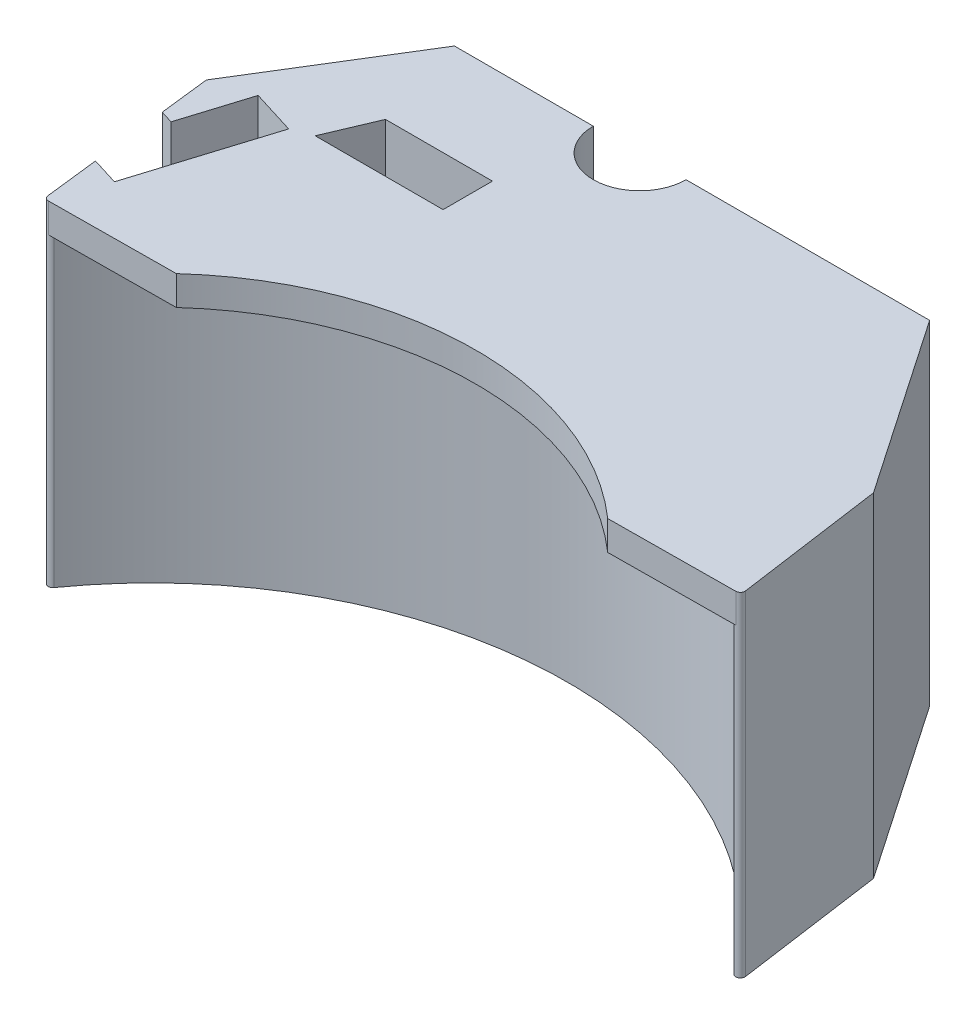
ISO-10303-21;
HEADER;
FILE_DESCRIPTION(('STEP AP214'),'2;1');
FILE_NAME('part.step','',(''),(''),'','','');
FILE_SCHEMA(('AUTOMOTIVE_DESIGN { 1 0 10303 214 1 1 1 1 }'));
ENDSEC;
DATA;
#1=APPLICATION_CONTEXT('core data for automotive mechanical design processes');
#2=APPLICATION_PROTOCOL_DEFINITION('international standard','automotive_design',2000,#1);
#3=PRODUCT_CONTEXT('',#1,'mechanical');
#4=PRODUCT('Part','Part','',(#3));
#5=PRODUCT_RELATED_PRODUCT_CATEGORY('part','',(#4));
#6=PRODUCT_DEFINITION_FORMATION('','',#4);
#7=PRODUCT_DEFINITION_CONTEXT('part definition',#1,'design');
#8=PRODUCT_DEFINITION('design','',#6,#7);
#9=PRODUCT_DEFINITION_SHAPE('','',#8);
#10=(LENGTH_UNIT() NAMED_UNIT(*) SI_UNIT(.MILLI.,.METRE.));
#11=(NAMED_UNIT(*) PLANE_ANGLE_UNIT() SI_UNIT($,.RADIAN.));
#12=(NAMED_UNIT(*) SI_UNIT($,.STERADIAN.) SOLID_ANGLE_UNIT());
#13=UNCERTAINTY_MEASURE_WITH_UNIT(LENGTH_MEASURE(1.E-05),#10,'distance_accuracy_value','');
#14=(GEOMETRIC_REPRESENTATION_CONTEXT(3) GLOBAL_UNCERTAINTY_ASSIGNED_CONTEXT((#13)) GLOBAL_UNIT_ASSIGNED_CONTEXT((#10,
#11,#12)) REPRESENTATION_CONTEXT('',''));
#15=CARTESIAN_POINT('',(0.,0.,0.));
#16=DIRECTION('',(0.,0.,1.));
#17=DIRECTION('',(1.,0.,0.));
#18=AXIS2_PLACEMENT_3D('',#15,#16,#17);
#19=CARTESIAN_POINT('',(-438.150016701856,15.24,160.02));
#20=DIRECTION('',(0.,-1.,0.));
#21=DIRECTION('',(0.,0.,-1.));
#22=AXIS2_PLACEMENT_3D('',#19,#20,#21);
#23=CYLINDRICAL_SURFACE('',#22,114.);
#24=DIRECTION('',(0.,-1.,0.));
#25=VECTOR('',#24,1.);
#26=CARTESIAN_POINT('',(-346.401804174719,15.24,92.3571187572149));
#27=LINE('',#26,#25);
#28=CARTESIAN_POINT('',(-346.401804174719,-76.2,92.3571187572149));
#29=VERTEX_POINT('',#28);
#30=CARTESIAN_POINT('',(-346.401804174719,7.19999999999998,92.3571187572149));
#31=VERTEX_POINT('',#30);
#32=EDGE_CURVE('E418',#29,#31,#27,.F.);
#33=ORIENTED_EDGE('',*,*,#32,.T.);
#34=CARTESIAN_POINT('',(-438.150016701856,7.2,160.02));
#35=DIRECTION('',(0.,-1.,0.));
#36=DIRECTION('',(1.,0.,0.));
#37=AXIS2_PLACEMENT_3D('',#34,#35,#36);
#38=CIRCLE('',#37,114.);
#39=CARTESIAN_POINT('',(-531.0092145895,7.20000000000004,93.8900569510041));
#40=VERTEX_POINT('',#39);
#41=EDGE_CURVE('E352',#31,#40,#38,.F.);
#42=ORIENTED_EDGE('',*,*,#41,.T.);
#43=DIRECTION('',(0.,-1.,0.));
#44=VECTOR('',#43,1.);
#45=CARTESIAN_POINT('',(-531.0092145895,15.24,93.8900569510041));
#46=LINE('',#45,#44);
#47=CARTESIAN_POINT('',(-531.0092145895,-76.2,93.890056951004));
#48=VERTEX_POINT('',#47);
#49=EDGE_CURVE('E416',#40,#48,#46,.T.);
#50=ORIENTED_EDGE('',*,*,#49,.T.);
#51=CARTESIAN_POINT('',(-438.150016701856,-76.2,160.02));
#52=DIRECTION('',(0.,-1.,0.));
#53=DIRECTION('',(0.,0.,1.));
#54=AXIS2_PLACEMENT_3D('',#51,#52,#53);
#55=CIRCLE('',#54,114.);
#56=EDGE_CURVE('E357',#48,#29,#55,.T.);
#57=ORIENTED_EDGE('',*,*,#56,.T.);
#58=EDGE_LOOP('',(#33,#42,#50,#57));
#59=FACE_BOUND('',#58,.T.);
#60=ADVANCED_FACE('F33',(#59),#23,.F.);
#61=CARTESIAN_POINT('',(-349.858652302487,15.24,50.6770177360921));
#62=DIRECTION('',(-0.990235829893133,0.,0.139402299822702));
#63=DIRECTION('',(0.139402299822702,0.,0.990235829893133));
#64=AXIS2_PLACEMENT_3D('',#61,#62,#63);
#65=PLANE('',#64);
#66=DIRECTION('',(-0.139402299822702,0.,-0.990235829893133));
#67=VECTOR('',#66,1.);
#68=CARTESIAN_POINT('',(-349.858652302487,15.24,50.6770177360921));
#69=LINE('',#68,#67);
#70=CARTESIAN_POINT('',(-344.122097390847,15.24,91.4262895980336));
#71=VERTEX_POINT('',#70);
#72=CARTESIAN_POINT('',(-349.858652302487,15.24,50.6770177360921));
#73=VERTEX_POINT('',#72);
#74=EDGE_CURVE('E380',#71,#73,#69,.T.);
#75=ORIENTED_EDGE('',*,*,#74,.F.);
#76=DIRECTION('',(0.,-1.,0.));
#77=VECTOR('',#76,1.);
#78=CARTESIAN_POINT('',(-344.122097390847,15.24,91.4262895980336));
#79=LINE('',#78,#77);
#80=CARTESIAN_POINT('',(-344.122097390847,-76.2,91.4262895980336));
#81=VERTEX_POINT('',#80);
#82=EDGE_CURVE('E409',#71,#81,#79,.T.);
#83=ORIENTED_EDGE('',*,*,#82,.T.);
#84=DIRECTION('',(-0.139402299822702,0.,-0.990235829893133));
#85=VECTOR('',#84,1.);
#86=CARTESIAN_POINT('',(-349.858652302487,-76.2,50.6770177360921));
#87=LINE('',#86,#85);
#88=CARTESIAN_POINT('',(-349.858652302487,-76.2,50.6770177360921));
#89=VERTEX_POINT('',#88);
#90=EDGE_CURVE('E360',#81,#89,#87,.T.);
#91=ORIENTED_EDGE('',*,*,#90,.T.);
#92=DIRECTION('',(0.,-1.,0.));
#93=VECTOR('',#92,1.);
#94=CARTESIAN_POINT('',(-349.858652302487,15.24,50.6770177360921));
#95=LINE('',#94,#93);
#96=EDGE_CURVE('E406',#73,#89,#95,.T.);
#97=ORIENTED_EDGE('',*,*,#96,.F.);
#98=EDGE_LOOP('',(#75,#83,#91,#97));
#99=FACE_BOUND('',#98,.T.);
#100=ADVANCED_FACE('F488',(#99),#65,.F.);
#101=CARTESIAN_POINT('',(-383.060284531982,15.24,2.10083146000001));
#102=DIRECTION('',(-0.825582053707507,0.,0.564282086013808));
#103=DIRECTION('',(0.564282086013808,0.,0.825582053707507));
#104=AXIS2_PLACEMENT_3D('',#101,#102,#103);
#105=PLANE('',#104);
#106=ORIENTED_EDGE('',*,*,#96,.T.);
#107=DIRECTION('',(-0.564282086013808,0.,-0.825582053707507));
#108=VECTOR('',#107,1.);
#109=CARTESIAN_POINT('',(-383.060284531982,-76.2,2.10083146000001));
#110=LINE('',#109,#108);
#111=CARTESIAN_POINT('',(-383.060284531982,-76.2,2.10083146000001));
#112=VERTEX_POINT('',#111);
#113=EDGE_CURVE('E362',#89,#112,#110,.T.);
#114=ORIENTED_EDGE('',*,*,#113,.T.);
#115=DIRECTION('',(0.,-1.,0.));
#116=VECTOR('',#115,1.);
#117=CARTESIAN_POINT('',(-383.060284531982,15.24,2.10083146000001));
#118=LINE('',#117,#116);
#119=CARTESIAN_POINT('',(-383.060284531982,15.24,2.10083146000001));
#120=VERTEX_POINT('',#119);
#121=EDGE_CURVE('E404',#120,#112,#118,.T.);
#122=ORIENTED_EDGE('',*,*,#121,.F.);
#123=DIRECTION('',(-0.564282086013808,0.,-0.825582053707507));
#124=VECTOR('',#123,1.);
#125=CARTESIAN_POINT('',(-383.060284531982,15.24,2.10083146000001));
#126=LINE('',#125,#124);
#127=EDGE_CURVE('E382',#73,#120,#126,.T.);
#128=ORIENTED_EDGE('',*,*,#127,.F.);
#129=EDGE_LOOP('',(#106,#114,#122,#128));
#130=FACE_BOUND('',#129,.T.);
#131=ADVANCED_FACE('F495',(#130),#105,.F.);
#132=CARTESIAN_POINT('',(-449.75475454,15.24,2.10083146000001));
#133=DIRECTION('',(0.,0.,1.));
#134=DIRECTION('',(1.,0.,0.));
#135=AXIS2_PLACEMENT_3D('',#132,#133,#134);
#136=PLANE('',#135);
#137=ORIENTED_EDGE('',*,*,#121,.T.);
#138=DIRECTION('',(-1.,0.,0.));
#139=VECTOR('',#138,1.);
#140=CARTESIAN_POINT('',(-449.75475454,-76.2,2.10083146000001));
#141=LINE('',#140,#139);
#142=CARTESIAN_POINT('',(-449.75475454,-76.2,2.10083146000001));
#143=VERTEX_POINT('',#142);
#144=EDGE_CURVE('E365',#112,#143,#141,.T.);
#145=ORIENTED_EDGE('',*,*,#144,.T.);
#146=DIRECTION('',(0.,-1.,0.));
#147=VECTOR('',#146,1.);
#148=CARTESIAN_POINT('',(-449.75475454,15.24,2.10083146000001));
#149=LINE('',#148,#147);
#150=CARTESIAN_POINT('',(-449.75475454,15.24,2.10083146000001));
#151=VERTEX_POINT('',#150);
#152=EDGE_CURVE('E402',#151,#143,#149,.T.);
#153=ORIENTED_EDGE('',*,*,#152,.F.);
#154=DIRECTION('',(-1.,0.,0.));
#155=VECTOR('',#154,1.);
#156=CARTESIAN_POINT('',(-449.75475454,15.24,2.10083146000001));
#157=LINE('',#156,#155);
#158=EDGE_CURVE('E384',#120,#151,#157,.T.);
#159=ORIENTED_EDGE('',*,*,#158,.F.);
#160=EDGE_LOOP('',(#137,#145,#153,#159));
#161=FACE_BOUND('',#160,.T.);
#162=ADVANCED_FACE('F502',(#161),#136,.F.);
#163=CARTESIAN_POINT('',(-462.45475454,15.24,2.10083146000001));
#164=DIRECTION('',(0.,-1.,0.));
#165=DIRECTION('',(0.,0.,-1.));
#166=AXIS2_PLACEMENT_3D('',#163,#164,#165);
#167=CYLINDRICAL_SURFACE('',#166,12.7);
#168=ORIENTED_EDGE('',*,*,#152,.T.);
#169=CARTESIAN_POINT('',(-462.45475454,-76.2,2.10083146000001));
#170=DIRECTION('',(0.,-1.,0.));
#171=DIRECTION('',(0.,0.,1.));
#172=AXIS2_PLACEMENT_3D('',#169,#170,#171);
#173=CIRCLE('',#172,12.7);
#174=CARTESIAN_POINT('',(-475.15475454,-76.2,2.10083146));
#175=VERTEX_POINT('',#174);
#176=EDGE_CURVE('E368',#143,#175,#173,.T.);
#177=ORIENTED_EDGE('',*,*,#176,.T.);
#178=DIRECTION('',(0.,-1.,0.));
#179=VECTOR('',#178,1.);
#180=CARTESIAN_POINT('',(-475.15475454,15.24,2.10083146));
#181=LINE('',#180,#179);
#182=CARTESIAN_POINT('',(-475.15475454,15.24,2.10083146));
#183=VERTEX_POINT('',#182);
#184=EDGE_CURVE('E400',#183,#175,#181,.T.);
#185=ORIENTED_EDGE('',*,*,#184,.F.);
#186=CARTESIAN_POINT('',(-462.45475454,15.24,2.10083146000001));
#187=DIRECTION('',(0.,-1.,0.));
#188=DIRECTION('',(0.,0.,1.));
#189=AXIS2_PLACEMENT_3D('',#186,#187,#188);
#190=CIRCLE('',#189,12.7);
#191=EDGE_CURVE('E386',#151,#183,#190,.T.);
#192=ORIENTED_EDGE('',*,*,#191,.F.);
#193=EDGE_LOOP('',(#168,#177,#185,#192));
#194=FACE_BOUND('',#193,.T.);
#195=ADVANCED_FACE('F504',(#194),#167,.F.);
#196=CARTESIAN_POINT('',(-475.15475454,15.24,2.10083146000001));
#197=DIRECTION('',(0.,0.,1.));
#198=DIRECTION('',(1.,0.,0.));
#199=AXIS2_PLACEMENT_3D('',#196,#197,#198);
#200=PLANE('',#199);
#201=ORIENTED_EDGE('',*,*,#184,.T.);
#202=DIRECTION('',(-1.,0.,0.));
#203=VECTOR('',#202,1.);
#204=CARTESIAN_POINT('',(-475.15475454,-76.2,2.10083146000001));
#205=LINE('',#204,#203);
#206=CARTESIAN_POINT('',(-513.153172488717,-76.2,2.10083146000001));
#207=VERTEX_POINT('',#206);
#208=EDGE_CURVE('E371',#175,#207,#205,.T.);
#209=ORIENTED_EDGE('',*,*,#208,.T.);
#210=DIRECTION('',(0.,-1.,0.));
#211=VECTOR('',#210,1.);
#212=CARTESIAN_POINT('',(-513.153172488717,15.24,2.10083146000001));
#213=LINE('',#212,#211);
#214=CARTESIAN_POINT('',(-513.153172488717,15.24,2.10083146000001));
#215=VERTEX_POINT('',#214);
#216=EDGE_CURVE('E398',#215,#207,#213,.T.);
#217=ORIENTED_EDGE('',*,*,#216,.F.);
#218=DIRECTION('',(-1.,0.,0.));
#219=VECTOR('',#218,1.);
#220=CARTESIAN_POINT('',(-475.15475454,15.24,2.10083146000001));
#221=LINE('',#220,#219);
#222=EDGE_CURVE('E388',#183,#215,#221,.T.);
#223=ORIENTED_EDGE('',*,*,#222,.F.);
#224=EDGE_LOOP('',(#201,#209,#217,#223));
#225=FACE_BOUND('',#224,.T.);
#226=ADVANCED_FACE('F509',(#225),#200,.F.);
#227=CARTESIAN_POINT('',(-539.064824242868,15.24,44.1168489976352));
#228=DIRECTION('',(0.85115481108366,0.,0.524914743143246));
#229=DIRECTION('',(0.524914743143246,0.,-0.85115481108366));
#230=AXIS2_PLACEMENT_3D('',#227,#228,#229);
#231=PLANE('',#230);
#232=ORIENTED_EDGE('',*,*,#216,.T.);
#233=DIRECTION('',(-0.524914743143246,0.,0.85115481108366));
#234=VECTOR('',#233,1.);
#235=CARTESIAN_POINT('',(-539.064824242868,-76.2,44.1168489976352));
#236=LINE('',#235,#234);
#237=CARTESIAN_POINT('',(-539.064824242868,-76.2,44.1168489976352));
#238=VERTEX_POINT('',#237);
#239=EDGE_CURVE('E374',#207,#238,#236,.T.);
#240=ORIENTED_EDGE('',*,*,#239,.T.);
#241=DIRECTION('',(0.,-1.,0.));
#242=VECTOR('',#241,1.);
#243=CARTESIAN_POINT('',(-539.064824242868,15.24,44.1168489976352));
#244=LINE('',#243,#242);
#245=CARTESIAN_POINT('',(-539.064824242868,15.24,44.1168489976352));
#246=VERTEX_POINT('',#245);
#247=EDGE_CURVE('E396',#246,#238,#244,.T.);
#248=ORIENTED_EDGE('',*,*,#247,.F.);
#249=DIRECTION('',(-0.524914743143246,0.,0.85115481108366));
#250=VECTOR('',#249,1.);
#251=CARTESIAN_POINT('',(-539.064824242868,15.24,44.1168489976352));
#252=LINE('',#251,#250);
#253=EDGE_CURVE('E390',#215,#246,#252,.T.);
#254=ORIENTED_EDGE('',*,*,#253,.F.);
#255=EDGE_LOOP('',(#232,#240,#248,#254));
#256=FACE_BOUND('',#255,.T.);
#257=ADVANCED_FACE('F514',(#256),#231,.F.);
#258=CARTESIAN_POINT('',(-532.913087574329,15.24,96.6483943803009));
#259=DIRECTION('',(0.993212870838507,0.,-0.116310761328139));
#260=DIRECTION('',(-0.116310761328139,0.,-0.993212870838507));
#261=AXIS2_PLACEMENT_3D('',#258,#259,#260);
#262=PLANE('',#261);
#263=DIRECTION('',(0.116310761328139,0.,0.993212870838507));
#264=VECTOR('',#263,1.);
#265=CARTESIAN_POINT('',(-532.913087574329,15.24,96.6483943803009));
#266=LINE('',#265,#264);
#267=CARTESIAN_POINT('',(-535.038469596072,15.24,78.4991126170409));
#268=VERTEX_POINT('',#267);
#269=CARTESIAN_POINT('',(-533.305078982108,15.24,93.3010608488362));
#270=VERTEX_POINT('',#269);
#271=EDGE_CURVE('E392',#268,#270,#266,.T.);
#272=ORIENTED_EDGE('',*,*,#271,.F.);
#273=DIRECTION('',(0.,-1.,0.));
#274=VECTOR('',#273,1.);
#275=CARTESIAN_POINT('',(-535.038469596072,15.24,78.4991126170409));
#276=LINE('',#275,#274);
#277=CARTESIAN_POINT('',(-535.038469596072,-35.56,78.4991126170409));
#278=VERTEX_POINT('',#277);
#279=EDGE_CURVE('E322',#268,#278,#276,.T.);
#280=ORIENTED_EDGE('',*,*,#279,.T.);
#281=DIRECTION('',(0.116310761328139,0.,0.993212870838507));
#282=VECTOR('',#281,1.);
#283=CARTESIAN_POINT('',(-532.913087574329,-35.56,96.6483943803009));
#284=LINE('',#283,#282);
#285=CARTESIAN_POINT('',(-537.463163856085,-35.56,57.7939128625784));
#286=VERTEX_POINT('',#285);
#287=EDGE_CURVE('E11',#286,#278,#284,.T.);
#288=ORIENTED_EDGE('',*,*,#287,.F.);
#289=DIRECTION('',(0.,1.,0.));
#290=VECTOR('',#289,1.);
#291=CARTESIAN_POINT('',(-537.463163856085,15.24,57.7939128625784));
#292=LINE('',#291,#290);
#293=CARTESIAN_POINT('',(-537.463163856085,15.24,57.7939128625785));
#294=VERTEX_POINT('',#293);
#295=EDGE_CURVE('E312',#286,#294,#292,.T.);
#296=ORIENTED_EDGE('',*,*,#295,.T.);
#297=EDGE_CURVE('E393',#246,#294,#266,.T.);
#298=ORIENTED_EDGE('',*,*,#297,.F.);
#299=ORIENTED_EDGE('',*,*,#247,.T.);
#300=DIRECTION('',(0.116310761328139,0.,0.993212870838507));
#301=VECTOR('',#300,1.);
#302=CARTESIAN_POINT('',(-532.913087574329,-76.2,96.6483943803009));
#303=LINE('',#302,#301);
#304=CARTESIAN_POINT('',(-533.305078982108,-76.2,93.3010608488362));
#305=VERTEX_POINT('',#304);
#306=EDGE_CURVE('E377',#238,#305,#303,.T.);
#307=ORIENTED_EDGE('',*,*,#306,.T.);
#308=DIRECTION('',(0.,-1.,0.));
#309=VECTOR('',#308,1.);
#310=CARTESIAN_POINT('',(-533.305078982108,15.24,93.3010608488362));
#311=LINE('',#310,#309);
#312=EDGE_CURVE('E426',#305,#270,#311,.F.);
#313=ORIENTED_EDGE('',*,*,#312,.T.);
#314=EDGE_LOOP('',(#272,#280,#288,#296,#298,#299,#307,#313));
#315=FACE_BOUND('',#314,.T.);
#316=ADVANCED_FACE('F454',(#315),#262,.F.);
#317=CARTESIAN_POINT('',(-438.150016701856,15.24,160.02));
#318=DIRECTION('',(0.,1.,0.));
#319=DIRECTION('',(0.,0.,1.));
#320=AXIS2_PLACEMENT_3D('',#317,#318,#319);
#321=PLANE('',#320);
#322=DIRECTION('',(-0.999999999995461,0.,-3.01301515954876E-06));
#323=VECTOR('',#322,1.);
#324=CARTESIAN_POINT('',(-505.199519379139,15.24,28.9415613790663));
#325=LINE('',#324,#323);
#326=CARTESIAN_POINT('',(-475.918740123091,15.24,28.9416496024981));
#327=VERTEX_POINT('',#326);
#328=CARTESIAN_POINT('',(-505.199519379139,15.24,28.9415613790664));
#329=VERTEX_POINT('',#328);
#330=EDGE_CURVE('E56',#327,#329,#325,.T.);
#331=ORIENTED_EDGE('',*,*,#330,.F.);
#332=DIRECTION('',(0.,0.,-1.));
#333=VECTOR('',#332,1.);
#334=CARTESIAN_POINT('',(-475.918740123091,15.24,28.9416496024981));
#335=LINE('',#334,#333);
#336=CARTESIAN_POINT('',(-475.918740123091,15.24,42.4549044435147));
#337=VERTEX_POINT('',#336);
#338=EDGE_CURVE('E259',#337,#327,#335,.T.);
#339=ORIENTED_EDGE('',*,*,#338,.F.);
#340=DIRECTION('',(1.,0.,0.));
#341=VECTOR('',#340,1.);
#342=CARTESIAN_POINT('',(-475.918740123091,15.24,42.4549044435147));
#343=LINE('',#342,#341);
#344=CARTESIAN_POINT('',(-510.924193780754,15.24,42.4549044435147));
#345=VERTEX_POINT('',#344);
#346=EDGE_CURVE('E273',#345,#337,#343,.T.);
#347=ORIENTED_EDGE('',*,*,#346,.F.);
#348=DIRECTION('',(-0.390072871509408,0.,0.920783989278922));
#349=VECTOR('',#348,1.);
#350=CARTESIAN_POINT('',(-505.199519379139,15.24,28.9415613790663));
#351=LINE('',#350,#349);
#352=EDGE_CURVE('E270',#329,#345,#351,.T.);
#353=ORIENTED_EDGE('',*,*,#352,.F.);
#354=EDGE_LOOP('',(#331,#339,#347,#353));
#355=FACE_BOUND('',#354,.T.);
#356=DIRECTION('',(0.954849592597847,0.,0.297089642222218));
#357=VECTOR('',#356,1.);
#358=CARTESIAN_POINT('',(-423.576097047036,15.24,113.179251393389));
#359=LINE('',#358,#357);
#360=CARTESIAN_POINT('',(-527.506577570092,15.24,80.842567674886));
#361=VERTEX_POINT('',#360);
#362=EDGE_CURVE('E41',#268,#361,#359,.T.);
#363=ORIENTED_EDGE('',*,*,#362,.F.);
#364=ORIENTED_EDGE('',*,*,#271,.T.);
#365=CARTESIAN_POINT('',(-532.043698636143,15.24,93.1533461819495));
#366=DIRECTION('',(0.,1.,0.));
#367=DIRECTION('',(0.,0.,1.));
#368=AXIS2_PLACEMENT_3D('',#365,#366,#367);
#369=CIRCLE('',#368,1.27);
#370=CARTESIAN_POINT('',(-532.033153206869,15.24,94.4233023992741));
#371=VERTEX_POINT('',#370);
#372=EDGE_CURVE('E421',#270,#371,#369,.T.);
#373=ORIENTED_EDGE('',*,*,#372,.T.);
#374=DIRECTION('',(0.999965525452448,0.,-0.00830348761728746));
#375=VECTOR('',#374,1.);
#376=CARTESIAN_POINT('',(-497.266838740677,15.24,94.1346107850925));
#377=LINE('',#376,#375);
#378=CARTESIAN_POINT('',(-497.266838740677,15.24,94.1346107850925));
#379=VERTEX_POINT('',#378);
#380=EDGE_CURVE('E325',#371,#379,#377,.T.);
#381=ORIENTED_EDGE('',*,*,#380,.T.);
#382=CARTESIAN_POINT('',(-438.157620675636,15.24,159.104274947211));
#383=DIRECTION('',(0.,-1.,0.));
#384=DIRECTION('',(0.,0.,-1.));
#385=AXIS2_PLACEMENT_3D('',#382,#383,#384);
#386=CIRCLE('',#385,87.8348274979742);
#387=CARTESIAN_POINT('',(-380.13546593173,15.24,93.1619783503145));
#388=VERTEX_POINT('',#387);
#389=EDGE_CURVE('E330',#379,#388,#386,.T.);
#390=ORIENTED_EDGE('',*,*,#389,.T.);
#391=DIRECTION('',(0.999965525452447,0.,-0.00830348761728545));
#392=VECTOR('',#391,1.);
#393=CARTESIAN_POINT('',(-380.13546593173,15.24,93.1619783503145));
#394=LINE('',#393,#392);
#395=CARTESIAN_POINT('',(-345.369151465537,15.24,92.873286736133));
#396=VERTEX_POINT('',#395);
#397=EDGE_CURVE('E326',#388,#396,#394,.T.);
#398=ORIENTED_EDGE('',*,*,#397,.T.);
#399=CARTESIAN_POINT('',(-345.379696894811,15.24,91.6033305188084));
#400=DIRECTION('',(0.,1.,0.));
#401=DIRECTION('',(0.,0.,1.));
#402=AXIS2_PLACEMENT_3D('',#399,#400,#401);
#403=CIRCLE('',#402,1.27);
#404=EDGE_CURVE('E424',#396,#71,#403,.T.);
#405=ORIENTED_EDGE('',*,*,#404,.T.);
#406=ORIENTED_EDGE('',*,*,#74,.T.);
#407=ORIENTED_EDGE('',*,*,#127,.T.);
#408=ORIENTED_EDGE('',*,*,#158,.T.);
#409=ORIENTED_EDGE('',*,*,#191,.T.);
#410=ORIENTED_EDGE('',*,*,#222,.T.);
#411=ORIENTED_EDGE('',*,*,#253,.T.);
#412=ORIENTED_EDGE('',*,*,#297,.T.);
#413=DIRECTION('',(-0.954849592597847,0.,-0.297089642222218));
#414=VECTOR('',#413,1.);
#415=CARTESIAN_POINT('',(-533.973609711751,15.24,58.8796444796747));
#416=LINE('',#415,#414);
#417=CARTESIAN_POINT('',(-533.973609711751,15.24,58.8796444796748));
#418=VERTEX_POINT('',#417);
#419=EDGE_CURVE('E303',#418,#294,#416,.T.);
#420=ORIENTED_EDGE('',*,*,#419,.F.);
#421=DIRECTION('',(-0.297089642222218,0.,0.954849592597847));
#422=VECTOR('',#421,1.);
#423=CARTESIAN_POINT('',(-528.314052027418,15.24,40.6897597406858));
#424=LINE('',#423,#422);
#425=CARTESIAN_POINT('',(-528.314052027418,15.24,40.6897597406858));
#426=VERTEX_POINT('',#425);
#427=EDGE_CURVE('E280',#426,#418,#424,.T.);
#428=ORIENTED_EDGE('',*,*,#427,.F.);
#429=DIRECTION('',(-0.954849592597847,0.,-0.297089642222218));
#430=VECTOR('',#429,1.);
#431=CARTESIAN_POINT('',(-528.314052027418,15.24,40.6897597406858));
#432=LINE('',#431,#430);
#433=CARTESIAN_POINT('',(-516.187462201425,15.24,44.462798196908));
#434=VERTEX_POINT('',#433);
#435=EDGE_CURVE('E290',#434,#426,#432,.T.);
#436=ORIENTED_EDGE('',*,*,#435,.F.);
#437=DIRECTION('',(0.297089642222217,0.,-0.954849592597848));
#438=VECTOR('',#437,1.);
#439=CARTESIAN_POINT('',(-516.187462201425,15.24,44.462798196908));
#440=LINE('',#439,#438);
#441=EDGE_CURVE('E305',#361,#434,#440,.T.);
#442=ORIENTED_EDGE('',*,*,#441,.F.);
#443=EDGE_LOOP('',(#363,#364,#373,#381,#390,#398,#405,#406,#407,#408,#409,#410,#411,#412,#420,
#428,#436,#442));
#444=FACE_BOUND('',#443,.T.);
#445=ADVANCED_FACE('F443',(#355,#444),#321,.T.);
#446=CARTESIAN_POINT('',(-438.150016701856,-76.2,160.02));
#447=DIRECTION('',(0.,1.,0.));
#448=DIRECTION('',(0.,0.,1.));
#449=AXIS2_PLACEMENT_3D('',#446,#447,#448);
#450=PLANE('',#449);
#451=DIRECTION('',(-0.95765231435713,0.,0.287927151909006));
#452=VECTOR('',#451,1.);
#453=CARTESIAN_POINT('',(-512.958981794907,-76.2,54.0747195489404));
#454=LINE('',#453,#452);
#455=CARTESIAN_POINT('',(-477.784341144421,-76.2,43.4991338691672));
#456=VERTEX_POINT('',#455);
#457=CARTESIAN_POINT('',(-512.958981794907,-76.2,54.0747195489404));
#458=VERTEX_POINT('',#457);
#459=EDGE_CURVE('E246',#456,#458,#454,.T.);
#460=ORIENTED_EDGE('',*,*,#459,.F.);
#461=DIRECTION('',(0.,0.,1.));
#462=VECTOR('',#461,1.);
#463=CARTESIAN_POINT('',(-477.784341144421,-76.2,43.4991338691672));
#464=LINE('',#463,#462);
#465=CARTESIAN_POINT('',(-477.784341144421,-76.2,30.7503752572347));
#466=VERTEX_POINT('',#465);
#467=EDGE_CURVE('E48',#466,#456,#464,.T.);
#468=ORIENTED_EDGE('',*,*,#467,.F.);
#469=DIRECTION('',(0.997226486888769,0.,0.0744267011729258));
#470=VECTOR('',#469,1.);
#471=CARTESIAN_POINT('',(-477.784341144421,-76.2,30.7503752572347));
#472=LINE('',#471,#470);
#473=CARTESIAN_POINT('',(-493.297876549059,-76.2,29.5925427298428));
#474=VERTEX_POINT('',#473);
#475=EDGE_CURVE('E237',#474,#466,#472,.T.);
#476=ORIENTED_EDGE('',*,*,#475,.F.);
#477=CARTESIAN_POINT('',(-494.715705206403,-76.2,48.5897073050739));
#478=DIRECTION('',(0.,-1.,0.));
#479=DIRECTION('',(0.,0.,-1.));
#480=AXIS2_PLACEMENT_3D('',#477,#478,#479);
#481=CIRCLE('',#480,19.05);
#482=EDGE_CURVE('E240',#458,#474,#481,.T.);
#483=ORIENTED_EDGE('',*,*,#482,.F.);
#484=EDGE_LOOP('',(#460,#468,#476,#483));
#485=FACE_BOUND('',#484,.T.);
#486=ORIENTED_EDGE('',*,*,#90,.F.);
#487=CARTESIAN_POINT('',(-345.379696894811,-76.2,91.6033305188084));
#488=DIRECTION('',(0.,1.,0.));
#489=DIRECTION('',(0.,0.,1.));
#490=AXIS2_PLACEMENT_3D('',#487,#488,#489);
#491=CIRCLE('',#490,1.27);
#492=EDGE_CURVE('E414',#81,#29,#491,.F.);
#493=ORIENTED_EDGE('',*,*,#492,.T.);
#494=ORIENTED_EDGE('',*,*,#56,.F.);
#495=CARTESIAN_POINT('',(-532.043698636143,-76.2,93.1533461819495));
#496=DIRECTION('',(0.,1.,0.));
#497=DIRECTION('',(0.,0.,1.));
#498=AXIS2_PLACEMENT_3D('',#495,#496,#497);
#499=CIRCLE('',#498,1.27);
#500=EDGE_CURVE('E412',#48,#305,#499,.F.);
#501=ORIENTED_EDGE('',*,*,#500,.T.);
#502=ORIENTED_EDGE('',*,*,#306,.F.);
#503=ORIENTED_EDGE('',*,*,#239,.F.);
#504=ORIENTED_EDGE('',*,*,#208,.F.);
#505=ORIENTED_EDGE('',*,*,#176,.F.);
#506=ORIENTED_EDGE('',*,*,#144,.F.);
#507=ORIENTED_EDGE('',*,*,#113,.F.);
#508=EDGE_LOOP('',(#486,#493,#494,#501,#502,#503,#504,#505,#506,#507));
#509=FACE_BOUND('',#508,.T.);
#510=ADVANCED_FACE('F485',(#485,#509),#450,.F.);
#511=CARTESIAN_POINT('',(-345.379696894811,15.24,91.6033305188084));
#512=DIRECTION('',(0.,-1.,0.));
#513=DIRECTION('',(0.,0.,-1.));
#514=AXIS2_PLACEMENT_3D('',#511,#512,#513);
#515=CYLINDRICAL_SURFACE('',#514,1.27);
#516=CARTESIAN_POINT('',(-345.379696894811,7.19999999999998,91.6033305188084));
#517=DIRECTION('',(0.,-1.,0.));
#518=DIRECTION('',(1.,0.,0.));
#519=AXIS2_PLACEMENT_3D('',#516,#517,#518);
#520=CIRCLE('',#519,1.27);
#521=CARTESIAN_POINT('',(-345.369151465537,7.19999999999998,92.873286736133));
#522=VERTEX_POINT('',#521);
#523=EDGE_CURVE('E354',#31,#522,#520,.F.);
#524=ORIENTED_EDGE('',*,*,#523,.F.);
#525=ORIENTED_EDGE('',*,*,#32,.F.);
#526=ORIENTED_EDGE('',*,*,#492,.F.);
#527=ORIENTED_EDGE('',*,*,#82,.F.);
#528=ORIENTED_EDGE('',*,*,#404,.F.);
#529=DIRECTION('',(0.,1.,0.));
#530=VECTOR('',#529,1.);
#531=CARTESIAN_POINT('',(-345.369151465537,-185.869732212848,92.8732867361331));
#532=LINE('',#531,#530);
#533=EDGE_CURVE('E341',#522,#396,#532,.T.);
#534=ORIENTED_EDGE('',*,*,#533,.F.);
#535=EDGE_LOOP('',(#524,#525,#526,#527,#528,#534));
#536=FACE_BOUND('',#535,.T.);
#537=ADVANCED_FACE('F472',(#536),#515,.T.);
#538=CARTESIAN_POINT('',(-532.043698636143,15.24,93.1533461819495));
#539=DIRECTION('',(0.,-1.,0.));
#540=DIRECTION('',(0.,0.,-1.));
#541=AXIS2_PLACEMENT_3D('',#538,#539,#540);
#542=CYLINDRICAL_SURFACE('',#541,1.27);
#543=CARTESIAN_POINT('',(-532.043698636143,7.20000000000004,93.1533461819495));
#544=DIRECTION('',(0.,-1.,0.));
#545=DIRECTION('',(1.,0.,0.));
#546=AXIS2_PLACEMENT_3D('',#543,#544,#545);
#547=CIRCLE('',#546,1.27);
#548=CARTESIAN_POINT('',(-532.033153206869,7.20000000000002,94.4233023992741));
#549=VERTEX_POINT('',#548);
#550=EDGE_CURVE('E429',#549,#40,#547,.F.);
#551=ORIENTED_EDGE('',*,*,#550,.F.);
#552=DIRECTION('',(0.,1.,0.));
#553=VECTOR('',#552,1.);
#554=CARTESIAN_POINT('',(-532.033153206869,-185.869732212848,94.4233023992741));
#555=LINE('',#554,#553);
#556=EDGE_CURVE('E348',#549,#371,#555,.T.);
#557=ORIENTED_EDGE('',*,*,#556,.T.);
#558=ORIENTED_EDGE('',*,*,#372,.F.);
#559=ORIENTED_EDGE('',*,*,#312,.F.);
#560=ORIENTED_EDGE('',*,*,#500,.F.);
#561=ORIENTED_EDGE('',*,*,#49,.F.);
#562=EDGE_LOOP('',(#551,#557,#558,#559,#560,#561));
#563=FACE_BOUND('',#562,.T.);
#564=ADVANCED_FACE('F35',(#563),#542,.T.);
#565=CARTESIAN_POINT('',(-480.498658946915,7.20000000000002,135.569999999999));
#566=DIRECTION('',(0.,-1.,0.));
#567=DIRECTION('',(-0.500000000000002,0.,0.866025403784438));
#568=AXIS2_PLACEMENT_3D('',#565,#566,#567);
#569=PLANE('',#568);
#570=ORIENTED_EDGE('',*,*,#41,.F.);
#571=ORIENTED_EDGE('',*,*,#523,.T.);
#572=DIRECTION('',(0.999965525452448,0.,-0.00830348761728545));
#573=VECTOR('',#572,1.);
#574=CARTESIAN_POINT('',(-380.13546593173,7.19999999999998,93.1619783503145));
#575=LINE('',#574,#573);
#576=CARTESIAN_POINT('',(-380.13546593173,7.19999999999997,93.1619783503145));
#577=VERTEX_POINT('',#576);
#578=EDGE_CURVE('E338',#577,#522,#575,.T.);
#579=ORIENTED_EDGE('',*,*,#578,.F.);
#580=CARTESIAN_POINT('',(-438.157620675636,7.19999999999998,159.104274947211));
#581=DIRECTION('',(0.,-1.,0.));
#582=DIRECTION('',(1.,0.,0.));
#583=AXIS2_PLACEMENT_3D('',#580,#581,#582);
#584=CIRCLE('',#583,87.8348274979742);
#585=CARTESIAN_POINT('',(-497.266838740677,7.20000000000001,94.1346107850925));
#586=VERTEX_POINT('',#585);
#587=EDGE_CURVE('E343',#586,#577,#584,.T.);
#588=ORIENTED_EDGE('',*,*,#587,.F.);
#589=DIRECTION('',(0.999965525452448,0.,-0.00830348761728746));
#590=VECTOR('',#589,1.);
#591=CARTESIAN_POINT('',(-497.266838740676,7.20000000000001,94.1346107850925));
#592=LINE('',#591,#590);
#593=EDGE_CURVE('E329',#549,#586,#592,.T.);
#594=ORIENTED_EDGE('',*,*,#593,.F.);
#595=ORIENTED_EDGE('',*,*,#550,.T.);
#596=EDGE_LOOP('',(#570,#571,#579,#588,#594,#595));
#597=FACE_BOUND('',#596,.T.);
#598=ADVANCED_FACE('F477',(#597),#569,.T.);
#599=CARTESIAN_POINT('',(-497.266838740677,-185.869732212848,94.1346107850925));
#600=DIRECTION('',(0.00830348761728746,0.,0.999965525452448));
#601=DIRECTION('',(0.999965525452448,0.,-0.00830348761728746));
#602=AXIS2_PLACEMENT_3D('',#599,#600,#601);
#603=PLANE('',#602);
#604=ORIENTED_EDGE('',*,*,#556,.F.);
#605=ORIENTED_EDGE('',*,*,#593,.T.);
#606=DIRECTION('',(0.,1.,0.));
#607=VECTOR('',#606,1.);
#608=CARTESIAN_POINT('',(-497.266838740677,-185.869732212848,94.1346107850925));
#609=LINE('',#608,#607);
#610=EDGE_CURVE('E337',#586,#379,#609,.T.);
#611=ORIENTED_EDGE('',*,*,#610,.T.);
#612=ORIENTED_EDGE('',*,*,#380,.F.);
#613=EDGE_LOOP('',(#604,#605,#611,#612));
#614=FACE_BOUND('',#613,.T.);
#615=ADVANCED_FACE('F461',(#614),#603,.T.);
#616=CARTESIAN_POINT('',(-438.157620675636,-185.869732212848,159.104274947211));
#617=DIRECTION('',(0.,1.,0.));
#618=DIRECTION('',(0.,0.,1.));
#619=AXIS2_PLACEMENT_3D('',#616,#617,#618);
#620=CYLINDRICAL_SURFACE('',#619,87.8348274979742);
#621=ORIENTED_EDGE('',*,*,#610,.F.);
#622=ORIENTED_EDGE('',*,*,#587,.T.);
#623=DIRECTION('',(0.,1.,0.));
#624=VECTOR('',#623,1.);
#625=CARTESIAN_POINT('',(-380.13546593173,-185.869732212848,93.1619783503145));
#626=LINE('',#625,#624);
#627=EDGE_CURVE('E342',#577,#388,#626,.T.);
#628=ORIENTED_EDGE('',*,*,#627,.T.);
#629=ORIENTED_EDGE('',*,*,#389,.F.);
#630=EDGE_LOOP('',(#621,#622,#628,#629));
#631=FACE_BOUND('',#630,.T.);
#632=ADVANCED_FACE('F466',(#631),#620,.F.);
#633=CARTESIAN_POINT('',(-380.13546593173,-185.869732212848,93.1619783503145));
#634=DIRECTION('',(0.00830348761728545,0.,0.999965525452448));
#635=DIRECTION('',(0.999965525452448,0.,-0.00830348761728545));
#636=AXIS2_PLACEMENT_3D('',#633,#634,#635);
#637=PLANE('',#636);
#638=ORIENTED_EDGE('',*,*,#627,.F.);
#639=ORIENTED_EDGE('',*,*,#578,.T.);
#640=ORIENTED_EDGE('',*,*,#533,.T.);
#641=ORIENTED_EDGE('',*,*,#397,.F.);
#642=EDGE_LOOP('',(#638,#639,#640,#641));
#643=FACE_BOUND('',#642,.T.);
#644=ADVANCED_FACE('F470',(#643),#637,.T.);
#645=CARTESIAN_POINT('',(-685.8,-35.56,-1.65978332000045));
#646=DIRECTION('',(0.,1.,0.));
#647=DIRECTION('',(0.,0.,1.));
#648=AXIS2_PLACEMENT_3D('',#645,#646,#647);
#649=PLANE('',#648);
#650=ORIENTED_EDGE('',*,*,#287,.T.);
#651=DIRECTION('',(0.954849592597847,0.,0.297089642222218));
#652=VECTOR('',#651,1.);
#653=CARTESIAN_POINT('',(-527.506577570092,-35.56,80.842567674886));
#654=LINE('',#653,#652);
#655=CARTESIAN_POINT('',(-527.506577570092,-35.56,80.842567674886));
#656=VERTEX_POINT('',#655);
#657=EDGE_CURVE('E293',#278,#656,#654,.T.);
#658=ORIENTED_EDGE('',*,*,#657,.T.);
#659=DIRECTION('',(0.297089642222217,0.,-0.954849592597848));
#660=VECTOR('',#659,1.);
#661=CARTESIAN_POINT('',(-516.187462201425,-35.56,44.462798196908));
#662=LINE('',#661,#660);
#663=CARTESIAN_POINT('',(-516.187462201425,-35.56,44.462798196908));
#664=VERTEX_POINT('',#663);
#665=EDGE_CURVE('E295',#656,#664,#662,.T.);
#666=ORIENTED_EDGE('',*,*,#665,.T.);
#667=DIRECTION('',(-0.954849592597847,0.,-0.297089642222218));
#668=VECTOR('',#667,1.);
#669=CARTESIAN_POINT('',(-528.314052027418,-35.56,40.6897597406858));
#670=LINE('',#669,#668);
#671=CARTESIAN_POINT('',(-528.314052027418,-35.56,40.6897597406858));
#672=VERTEX_POINT('',#671);
#673=EDGE_CURVE('E298',#664,#672,#670,.T.);
#674=ORIENTED_EDGE('',*,*,#673,.T.);
#675=DIRECTION('',(-0.297089642222218,0.,0.954849592597847));
#676=VECTOR('',#675,1.);
#677=CARTESIAN_POINT('',(-528.314052027418,-35.56,40.6897597406858));
#678=LINE('',#677,#676);
#679=CARTESIAN_POINT('',(-533.973609711751,-35.56,58.8796444796747));
#680=VERTEX_POINT('',#679);
#681=EDGE_CURVE('E286',#672,#680,#678,.T.);
#682=ORIENTED_EDGE('',*,*,#681,.T.);
#683=DIRECTION('',(-0.954849592597847,0.,-0.297089642222218));
#684=VECTOR('',#683,1.);
#685=CARTESIAN_POINT('',(-533.973609711751,-35.56,58.8796444796747));
#686=LINE('',#685,#684);
#687=EDGE_CURVE('E289',#680,#286,#686,.T.);
#688=ORIENTED_EDGE('',*,*,#687,.T.);
#689=EDGE_LOOP('',(#650,#658,#666,#674,#682,#688));
#690=FACE_BOUND('',#689,.T.);
#691=ADVANCED_FACE('F451',(#690),#649,.T.);
#692=CARTESIAN_POINT('',(-527.506577570092,-35.56,80.842567674886));
#693=DIRECTION('',(-0.297089642222218,0.,0.954849592597847));
#694=DIRECTION('',(0.954849592597847,0.,0.297089642222218));
#695=AXIS2_PLACEMENT_3D('',#692,#693,#694);
#696=PLANE('',#695);
#697=ORIENTED_EDGE('',*,*,#362,.T.);
#698=DIRECTION('',(0.,1.,0.));
#699=VECTOR('',#698,1.);
#700=CARTESIAN_POINT('',(-527.506577570092,-35.56,80.842567674886));
#701=LINE('',#700,#699);
#702=EDGE_CURVE('E315',#656,#361,#701,.T.);
#703=ORIENTED_EDGE('',*,*,#702,.F.);
#704=ORIENTED_EDGE('',*,*,#657,.F.);
#705=ORIENTED_EDGE('',*,*,#279,.F.);
#706=EDGE_LOOP('',(#697,#703,#704,#705));
#707=FACE_BOUND('',#706,.T.);
#708=ADVANCED_FACE('F434',(#707),#696,.F.);
#709=CARTESIAN_POINT('',(-533.973609711751,-35.56,58.8796444796747));
#710=DIRECTION('',(0.297089642222218,0.,-0.954849592597847));
#711=DIRECTION('',(-0.954849592597847,0.,-0.297089642222218));
#712=AXIS2_PLACEMENT_3D('',#709,#710,#711);
#713=PLANE('',#712);
#714=ORIENTED_EDGE('',*,*,#687,.F.);
#715=DIRECTION('',(0.,1.,0.));
#716=VECTOR('',#715,1.);
#717=CARTESIAN_POINT('',(-533.973609711751,-35.56,58.8796444796747));
#718=LINE('',#717,#716);
#719=EDGE_CURVE('E301',#680,#418,#718,.T.);
#720=ORIENTED_EDGE('',*,*,#719,.T.);
#721=ORIENTED_EDGE('',*,*,#419,.T.);
#722=ORIENTED_EDGE('',*,*,#295,.F.);
#723=EDGE_LOOP('',(#714,#720,#721,#722));
#724=FACE_BOUND('',#723,.T.);
#725=ADVANCED_FACE('F518',(#724),#713,.F.);
#726=CARTESIAN_POINT('',(-528.314052027418,-35.56,40.6897597406858));
#727=DIRECTION('',(-0.954849592597847,0.,-0.297089642222218));
#728=DIRECTION('',(-0.297089642222218,0.,0.954849592597847));
#729=AXIS2_PLACEMENT_3D('',#726,#727,#728);
#730=PLANE('',#729);
#731=ORIENTED_EDGE('',*,*,#427,.T.);
#732=ORIENTED_EDGE('',*,*,#719,.F.);
#733=ORIENTED_EDGE('',*,*,#681,.F.);
#734=DIRECTION('',(0.,1.,0.));
#735=VECTOR('',#734,1.);
#736=CARTESIAN_POINT('',(-528.314052027418,-35.56,40.6897597406858));
#737=LINE('',#736,#735);
#738=EDGE_CURVE('E310',#672,#426,#737,.T.);
#739=ORIENTED_EDGE('',*,*,#738,.T.);
#740=EDGE_LOOP('',(#731,#732,#733,#739));
#741=FACE_BOUND('',#740,.T.);
#742=ADVANCED_FACE('F520',(#741),#730,.F.);
#743=CARTESIAN_POINT('',(-528.314052027418,-35.56,40.6897597406858));
#744=DIRECTION('',(0.297089642222218,0.,-0.954849592597847));
#745=DIRECTION('',(-0.954849592597847,0.,-0.297089642222218));
#746=AXIS2_PLACEMENT_3D('',#743,#744,#745);
#747=PLANE('',#746);
#748=ORIENTED_EDGE('',*,*,#435,.T.);
#749=ORIENTED_EDGE('',*,*,#738,.F.);
#750=ORIENTED_EDGE('',*,*,#673,.F.);
#751=DIRECTION('',(0.,1.,0.));
#752=VECTOR('',#751,1.);
#753=CARTESIAN_POINT('',(-516.187462201425,-35.56,44.462798196908));
#754=LINE('',#753,#752);
#755=EDGE_CURVE('E313',#664,#434,#754,.T.);
#756=ORIENTED_EDGE('',*,*,#755,.T.);
#757=EDGE_LOOP('',(#748,#749,#750,#756));
#758=FACE_BOUND('',#757,.T.);
#759=ADVANCED_FACE('F447',(#758),#747,.F.);
#760=CARTESIAN_POINT('',(-516.187462201425,-35.56,44.462798196908));
#761=DIRECTION('',(0.954849592597848,0.,0.297089642222217));
#762=DIRECTION('',(0.297089642222217,0.,-0.954849592597848));
#763=AXIS2_PLACEMENT_3D('',#760,#761,#762);
#764=PLANE('',#763);
#765=ORIENTED_EDGE('',*,*,#441,.T.);
#766=ORIENTED_EDGE('',*,*,#755,.F.);
#767=ORIENTED_EDGE('',*,*,#665,.F.);
#768=ORIENTED_EDGE('',*,*,#702,.T.);
#769=EDGE_LOOP('',(#765,#766,#767,#768));
#770=FACE_BOUND('',#769,.T.);
#771=ADVANCED_FACE('F441',(#770),#764,.F.);
#772=CARTESIAN_POINT('',(-505.199519379139,-22.86,28.9415613790663));
#773=DIRECTION('',(3.01301515954876E-06,0.,-0.999999999995461));
#774=DIRECTION('',(-0.999999999995461,0.,-3.01301515954876E-06));
#775=AXIS2_PLACEMENT_3D('',#772,#773,#774);
#776=PLANE('',#775);
#777=ORIENTED_EDGE('',*,*,#330,.T.);
#778=DIRECTION('',(0.,1.,0.));
#779=VECTOR('',#778,1.);
#780=CARTESIAN_POINT('',(-505.199519379139,-22.86,28.9415613790663));
#781=LINE('',#780,#779);
#782=CARTESIAN_POINT('',(-505.199519379139,-22.86,28.9415613790663));
#783=VERTEX_POINT('',#782);
#784=EDGE_CURVE('E268',#783,#329,#781,.T.);
#785=ORIENTED_EDGE('',*,*,#784,.F.);
#786=DIRECTION('',(-0.999999999995461,0.,-3.01301515954876E-06));
#787=VECTOR('',#786,1.);
#788=CARTESIAN_POINT('',(-505.199519379139,-22.86,28.9415613790663));
#789=LINE('',#788,#787);
#790=CARTESIAN_POINT('',(-475.918740123091,-22.86,28.9416496024981));
#791=VERTEX_POINT('',#790);
#792=EDGE_CURVE('E255',#791,#783,#789,.T.);
#793=ORIENTED_EDGE('',*,*,#792,.F.);
#794=DIRECTION('',(0.,1.,0.));
#795=VECTOR('',#794,1.);
#796=CARTESIAN_POINT('',(-475.918740123091,-22.86,28.9416496024981));
#797=LINE('',#796,#795);
#798=EDGE_CURVE('E278',#791,#327,#797,.T.);
#799=ORIENTED_EDGE('',*,*,#798,.T.);
#800=EDGE_LOOP('',(#777,#785,#793,#799));
#801=FACE_BOUND('',#800,.T.);
#802=ADVANCED_FACE('F605',(#801),#776,.F.);
#803=CARTESIAN_POINT('',(-475.918740123091,-22.86,28.9416496024981));
#804=DIRECTION('',(1.,0.,0.));
#805=DIRECTION('',(0.,0.,-1.));
#806=AXIS2_PLACEMENT_3D('',#803,#804,#805);
#807=PLANE('',#806);
#808=ORIENTED_EDGE('',*,*,#338,.T.);
#809=ORIENTED_EDGE('',*,*,#798,.F.);
#810=DIRECTION('',(0.,0.,-1.));
#811=VECTOR('',#810,1.);
#812=CARTESIAN_POINT('',(-475.918740123091,-22.86,28.9416496024981));
#813=LINE('',#812,#811);
#814=CARTESIAN_POINT('',(-475.918740123091,-22.86,42.4549044435147));
#815=VERTEX_POINT('',#814);
#816=EDGE_CURVE('E265',#815,#791,#813,.T.);
#817=ORIENTED_EDGE('',*,*,#816,.F.);
#818=DIRECTION('',(0.,1.,0.));
#819=VECTOR('',#818,1.);
#820=CARTESIAN_POINT('',(-475.918740123091,-22.86,42.4549044435147));
#821=LINE('',#820,#819);
#822=EDGE_CURVE('E281',#815,#337,#821,.T.);
#823=ORIENTED_EDGE('',*,*,#822,.T.);
#824=EDGE_LOOP('',(#808,#809,#817,#823));
#825=FACE_BOUND('',#824,.T.);
#826=ADVANCED_FACE('F610',(#825),#807,.F.);
#827=CARTESIAN_POINT('',(-475.918740123091,-22.86,42.4549044435147));
#828=DIRECTION('',(0.,0.,1.));
#829=DIRECTION('',(1.,0.,0.));
#830=AXIS2_PLACEMENT_3D('',#827,#828,#829);
#831=PLANE('',#830);
#832=ORIENTED_EDGE('',*,*,#346,.T.);
#833=ORIENTED_EDGE('',*,*,#822,.F.);
#834=DIRECTION('',(1.,0.,0.));
#835=VECTOR('',#834,1.);
#836=CARTESIAN_POINT('',(-475.918740123091,-22.86,42.4549044435147));
#837=LINE('',#836,#835);
#838=CARTESIAN_POINT('',(-510.924193780754,-22.86,42.4549044435147));
#839=VERTEX_POINT('',#838);
#840=EDGE_CURVE('E262',#839,#815,#837,.T.);
#841=ORIENTED_EDGE('',*,*,#840,.F.);
#842=DIRECTION('',(0.,1.,0.));
#843=VECTOR('',#842,1.);
#844=CARTESIAN_POINT('',(-510.924193780754,-22.86,42.4549044435147));
#845=LINE('',#844,#843);
#846=EDGE_CURVE('E283',#839,#345,#845,.T.);
#847=ORIENTED_EDGE('',*,*,#846,.T.);
#848=EDGE_LOOP('',(#832,#833,#841,#847));
#849=FACE_BOUND('',#848,.T.);
#850=ADVANCED_FACE('F619',(#849),#831,.F.);
#851=CARTESIAN_POINT('',(-505.199519379139,-22.86,28.9415613790663));
#852=DIRECTION('',(-0.920783989278922,0.,-0.390072871509408));
#853=DIRECTION('',(-0.390072871509408,0.,0.920783989278922));
#854=AXIS2_PLACEMENT_3D('',#851,#852,#853);
#855=PLANE('',#854);
#856=ORIENTED_EDGE('',*,*,#352,.T.);
#857=ORIENTED_EDGE('',*,*,#846,.F.);
#858=DIRECTION('',(-0.390072871509408,0.,0.920783989278922));
#859=VECTOR('',#858,1.);
#860=CARTESIAN_POINT('',(-505.199519379139,-22.86,28.9415613790663));
#861=LINE('',#860,#859);
#862=EDGE_CURVE('E258',#783,#839,#861,.T.);
#863=ORIENTED_EDGE('',*,*,#862,.F.);
#864=ORIENTED_EDGE('',*,*,#784,.T.);
#865=EDGE_LOOP('',(#856,#857,#863,#864));
#866=FACE_BOUND('',#865,.T.);
#867=ADVANCED_FACE('F629',(#866),#855,.F.);
#868=CARTESIAN_POINT('',(0.,-22.86,0.));
#869=DIRECTION('',(0.,-1.,0.));
#870=DIRECTION('',(0.,0.,-1.));
#871=AXIS2_PLACEMENT_3D('',#868,#869,#870);
#872=PLANE('',#871);
#873=ORIENTED_EDGE('',*,*,#792,.T.);
#874=ORIENTED_EDGE('',*,*,#862,.T.);
#875=ORIENTED_EDGE('',*,*,#840,.T.);
#876=ORIENTED_EDGE('',*,*,#816,.T.);
#877=EDGE_LOOP('',(#873,#874,#875,#876));
#878=FACE_BOUND('',#877,.T.);
#879=ADVANCED_FACE('F639',(#878),#872,.F.);
#880=CARTESIAN_POINT('',(-477.784341144421,-38.1,43.4991338691672));
#881=DIRECTION('',(1.,0.,0.));
#882=DIRECTION('',(0.,0.,-1.));
#883=AXIS2_PLACEMENT_3D('',#880,#881,#882);
#884=PLANE('',#883);
#885=ORIENTED_EDGE('',*,*,#467,.T.);
#886=DIRECTION('',(0.,-1.,0.));
#887=VECTOR('',#886,1.);
#888=CARTESIAN_POINT('',(-477.784341144421,-38.1,43.4991338691672));
#889=LINE('',#888,#887);
#890=CARTESIAN_POINT('',(-477.784341144421,-38.1,43.4991338691672));
#891=VERTEX_POINT('',#890);
#892=EDGE_CURVE('E215',#891,#456,#889,.T.);
#893=ORIENTED_EDGE('',*,*,#892,.F.);
#894=DIRECTION('',(0.,0.,1.));
#895=VECTOR('',#894,1.);
#896=CARTESIAN_POINT('',(-477.784341144421,-38.1,43.4991338691672));
#897=LINE('',#896,#895);
#898=CARTESIAN_POINT('',(-477.784341144421,-38.1,30.7503752572347));
#899=VERTEX_POINT('',#898);
#900=EDGE_CURVE('E219',#899,#891,#897,.T.);
#901=ORIENTED_EDGE('',*,*,#900,.F.);
#902=DIRECTION('',(0.,-1.,0.));
#903=VECTOR('',#902,1.);
#904=CARTESIAN_POINT('',(-477.784341144421,-38.1,30.7503752572347));
#905=LINE('',#904,#903);
#906=EDGE_CURVE('E250',#899,#466,#905,.T.);
#907=ORIENTED_EDGE('',*,*,#906,.T.);
#908=EDGE_LOOP('',(#885,#893,#901,#907));
#909=FACE_BOUND('',#908,.T.);
#910=ADVANCED_FACE('F217',(#909),#884,.F.);
#911=CARTESIAN_POINT('',(-477.784341144421,-38.1,30.7503752572347));
#912=DIRECTION('',(0.0744267011729258,0.,-0.997226486888769));
#913=DIRECTION('',(-0.997226486888769,0.,-0.0744267011729258));
#914=AXIS2_PLACEMENT_3D('',#911,#912,#913);
#915=PLANE('',#914);
#916=ORIENTED_EDGE('',*,*,#475,.T.);
#917=ORIENTED_EDGE('',*,*,#906,.F.);
#918=DIRECTION('',(0.997226486888769,0.,0.0744267011729258));
#919=VECTOR('',#918,1.);
#920=CARTESIAN_POINT('',(-477.784341144421,-38.1,30.7503752572347));
#921=LINE('',#920,#919);
#922=CARTESIAN_POINT('',(-493.297876549059,-38.1,29.5925427298428));
#923=VERTEX_POINT('',#922);
#924=EDGE_CURVE('E225',#923,#899,#921,.T.);
#925=ORIENTED_EDGE('',*,*,#924,.F.);
#926=DIRECTION('',(0.,-1.,0.));
#927=VECTOR('',#926,1.);
#928=CARTESIAN_POINT('',(-493.297876549059,-38.1,29.5925427298428));
#929=LINE('',#928,#927);
#930=EDGE_CURVE('E252',#923,#474,#929,.T.);
#931=ORIENTED_EDGE('',*,*,#930,.T.);
#932=EDGE_LOOP('',(#916,#917,#925,#931));
#933=FACE_BOUND('',#932,.T.);
#934=ADVANCED_FACE('F663',(#933),#915,.F.);
#935=CARTESIAN_POINT('',(-494.715705206403,-38.1,48.5897073050739));
#936=DIRECTION('',(0.,-1.,0.));
#937=DIRECTION('',(0.,0.,-1.));
#938=AXIS2_PLACEMENT_3D('',#935,#936,#937);
#939=CYLINDRICAL_SURFACE('',#938,19.05);
#940=ORIENTED_EDGE('',*,*,#482,.T.);
#941=ORIENTED_EDGE('',*,*,#930,.F.);
#942=CARTESIAN_POINT('',(-494.715705206403,-38.1,48.5897073050739));
#943=DIRECTION('',(0.,-1.,0.));
#944=DIRECTION('',(0.,0.,-1.));
#945=AXIS2_PLACEMENT_3D('',#942,#943,#944);
#946=CIRCLE('',#945,19.05);
#947=CARTESIAN_POINT('',(-512.958981794907,-38.1,54.0747195489404));
#948=VERTEX_POINT('',#947);
#949=EDGE_CURVE('E233',#948,#923,#946,.T.);
#950=ORIENTED_EDGE('',*,*,#949,.F.);
#951=DIRECTION('',(0.,-1.,0.));
#952=VECTOR('',#951,1.);
#953=CARTESIAN_POINT('',(-512.958981794907,-38.1,54.0747195489404));
#954=LINE('',#953,#952);
#955=EDGE_CURVE('E224',#948,#458,#954,.T.);
#956=ORIENTED_EDGE('',*,*,#955,.T.);
#957=EDGE_LOOP('',(#940,#941,#950,#956));
#958=FACE_BOUND('',#957,.T.);
#959=ADVANCED_FACE('F672',(#958),#939,.F.);
#960=CARTESIAN_POINT('',(-512.958981794907,-38.1,54.0747195489404));
#961=DIRECTION('',(0.287927151909006,0.,0.95765231435713));
#962=DIRECTION('',(0.957652314357131,0.,-0.287927151909006));
#963=AXIS2_PLACEMENT_3D('',#960,#961,#962);
#964=PLANE('',#963);
#965=ORIENTED_EDGE('',*,*,#459,.T.);
#966=ORIENTED_EDGE('',*,*,#955,.F.);
#967=DIRECTION('',(-0.95765231435713,0.,0.287927151909006));
#968=VECTOR('',#967,1.);
#969=CARTESIAN_POINT('',(-512.958981794907,-38.1,54.0747195489404));
#970=LINE('',#969,#968);
#971=EDGE_CURVE('E228',#891,#948,#970,.T.);
#972=ORIENTED_EDGE('',*,*,#971,.F.);
#973=ORIENTED_EDGE('',*,*,#892,.T.);
#974=EDGE_LOOP('',(#965,#966,#972,#973));
#975=FACE_BOUND('',#974,.T.);
#976=ADVANCED_FACE('F229',(#975),#964,.F.);
#977=CARTESIAN_POINT('',(-494.715705206403,-38.1,48.5897073050739));
#978=DIRECTION('',(0.,-1.,0.));
#979=DIRECTION('',(0.,0.,-1.));
#980=AXIS2_PLACEMENT_3D('',#977,#978,#979);
#981=PLANE('',#980);
#982=ORIENTED_EDGE('',*,*,#900,.T.);
#983=ORIENTED_EDGE('',*,*,#971,.T.);
#984=ORIENTED_EDGE('',*,*,#949,.T.);
#985=ORIENTED_EDGE('',*,*,#924,.T.);
#986=EDGE_LOOP('',(#982,#983,#984,#985));
#987=FACE_BOUND('',#986,.T.);
#988=ADVANCED_FACE('F235',(#987),#981,.T.);
#989=CLOSED_SHELL('',(#60,#100,#131,#162,#195,#226,#257,#316,#445,#510,#537,#564,#598,#615,#632,
#644,#691,#708,#725,#742,#759,#771,#802,#826,#850,#867,#879,#910,#934,#959,#976,#988));
#990=MANIFOLD_SOLID_BREP('B2',#989);
#991=ADVANCED_BREP_SHAPE_REPRESENTATION('',(#18,#990),#14);
#992=SHAPE_DEFINITION_REPRESENTATION(#9,#991);
ENDSEC;
END-ISO-10303-21;
